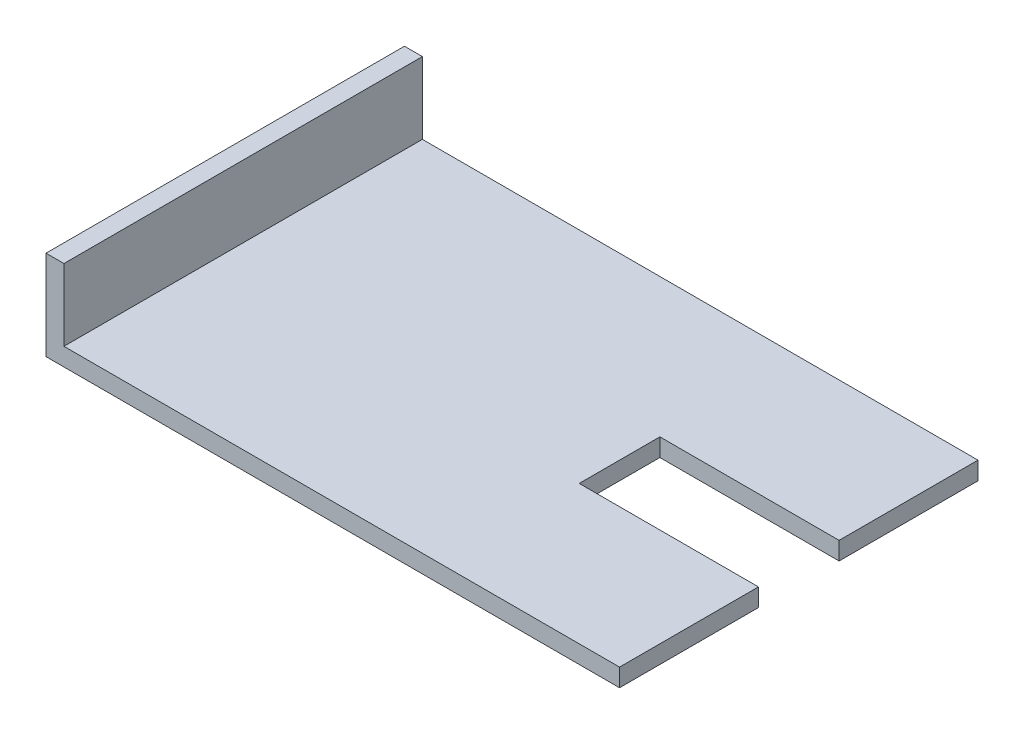
ISO-10303-21;
HEADER;
FILE_DESCRIPTION(('STEP AP214'),'2;1');
FILE_NAME('part.step','',(''),(''),'','','');
FILE_SCHEMA(('AUTOMOTIVE_DESIGN { 1 0 10303 214 1 1 1 1 }'));
ENDSEC;
DATA;
#1=APPLICATION_CONTEXT('core data for automotive mechanical design processes');
#2=APPLICATION_PROTOCOL_DEFINITION('international standard','automotive_design',2000,#1);
#3=PRODUCT_CONTEXT('',#1,'mechanical');
#4=PRODUCT('Part','Part','',(#3));
#5=PRODUCT_RELATED_PRODUCT_CATEGORY('part','',(#4));
#6=PRODUCT_DEFINITION_FORMATION('','',#4);
#7=PRODUCT_DEFINITION_CONTEXT('part definition',#1,'design');
#8=PRODUCT_DEFINITION('design','',#6,#7);
#9=PRODUCT_DEFINITION_SHAPE('','',#8);
#10=(LENGTH_UNIT() NAMED_UNIT(*) SI_UNIT(.MILLI.,.METRE.));
#11=(NAMED_UNIT(*) PLANE_ANGLE_UNIT() SI_UNIT($,.RADIAN.));
#12=(NAMED_UNIT(*) SI_UNIT($,.STERADIAN.) SOLID_ANGLE_UNIT());
#13=UNCERTAINTY_MEASURE_WITH_UNIT(LENGTH_MEASURE(1.E-05),#10,'distance_accuracy_value','');
#14=(GEOMETRIC_REPRESENTATION_CONTEXT(3) GLOBAL_UNCERTAINTY_ASSIGNED_CONTEXT((#13)) GLOBAL_UNIT_ASSIGNED_CONTEXT((#10,
#11,#12)) REPRESENTATION_CONTEXT('',''));
#15=CARTESIAN_POINT('',(0.,0.,0.));
#16=DIRECTION('',(0.,0.,1.));
#17=DIRECTION('',(1.,0.,0.));
#18=AXIS2_PLACEMENT_3D('',#15,#16,#17);
#19=CARTESIAN_POINT('',(320.,0.,200.));
#20=DIRECTION('',(-1.,0.,0.));
#21=DIRECTION('',(0.,0.,1.));
#22=AXIS2_PLACEMENT_3D('',#19,#20,#21);
#23=PLANE('',#22);
#24=DIRECTION('',(0.,0.,-1.));
#25=VECTOR('',#24,1.);
#26=CARTESIAN_POINT('',(320.,0.,200.));
#27=LINE('',#26,#25);
#28=CARTESIAN_POINT('',(320.,0.,200.));
#29=VERTEX_POINT('',#28);
#30=CARTESIAN_POINT('',(320.,0.,122.5));
#31=VERTEX_POINT('',#30);
#32=EDGE_CURVE('E124',#29,#31,#27,.T.);
#33=ORIENTED_EDGE('',*,*,#32,.T.);
#34=DIRECTION('',(0.,1.,0.));
#35=VECTOR('',#34,1.);
#36=CARTESIAN_POINT('',(320.,0.,122.5));
#37=LINE('',#36,#35);
#38=CARTESIAN_POINT('',(320.,10.,122.5));
#39=VERTEX_POINT('',#38);
#40=EDGE_CURVE('E147',#31,#39,#37,.T.);
#41=ORIENTED_EDGE('',*,*,#40,.T.);
#42=DIRECTION('',(0.,0.,-1.));
#43=VECTOR('',#42,1.);
#44=CARTESIAN_POINT('',(320.,10.,200.));
#45=LINE('',#44,#43);
#46=CARTESIAN_POINT('',(320.,10.,200.));
#47=VERTEX_POINT('',#46);
#48=EDGE_CURVE('E159',#47,#39,#45,.T.);
#49=ORIENTED_EDGE('',*,*,#48,.F.);
#50=DIRECTION('',(0.,1.,0.));
#51=VECTOR('',#50,1.);
#52=CARTESIAN_POINT('',(320.,0.,200.));
#53=LINE('',#52,#51);
#54=EDGE_CURVE('E67',#29,#47,#53,.T.);
#55=ORIENTED_EDGE('',*,*,#54,.F.);
#56=EDGE_LOOP('',(#33,#41,#49,#55));
#57=FACE_BOUND('',#56,.T.);
#58=ADVANCED_FACE('F43',(#57),#23,.F.);
#59=CARTESIAN_POINT('',(0.,10.,200.));
#60=DIRECTION('',(0.,1.,0.));
#61=DIRECTION('',(0.,0.,1.));
#62=AXIS2_PLACEMENT_3D('',#59,#60,#61);
#63=PLANE('',#62);
#64=DIRECTION('',(1.,0.,0.));
#65=VECTOR('',#64,1.);
#66=CARTESIAN_POINT('',(320.,10.,122.5));
#67=LINE('',#66,#65);
#68=CARTESIAN_POINT('',(220.,10.,122.5));
#69=VERTEX_POINT('',#68);
#70=EDGE_CURVE('E195',#69,#39,#67,.T.);
#71=ORIENTED_EDGE('',*,*,#70,.F.);
#72=DIRECTION('',(0.,0.,1.));
#73=VECTOR('',#72,1.);
#74=CARTESIAN_POINT('',(220.,10.,77.5));
#75=LINE('',#74,#73);
#76=CARTESIAN_POINT('',(220.,10.,77.5));
#77=VERTEX_POINT('',#76);
#78=EDGE_CURVE('E205',#77,#69,#75,.T.);
#79=ORIENTED_EDGE('',*,*,#78,.F.);
#80=DIRECTION('',(-1.,0.,0.));
#81=VECTOR('',#80,1.);
#82=CARTESIAN_POINT('',(320.,10.,77.4999999999999));
#83=LINE('',#82,#81);
#84=CARTESIAN_POINT('',(320.,10.,77.4999999999999));
#85=VERTEX_POINT('',#84);
#86=EDGE_CURVE('E208',#85,#77,#83,.T.);
#87=ORIENTED_EDGE('',*,*,#86,.F.);
#88=CARTESIAN_POINT('',(320.,10.,0.));
#89=VERTEX_POINT('',#88);
#90=EDGE_CURVE('E94',#85,#89,#45,.T.);
#91=ORIENTED_EDGE('',*,*,#90,.T.);
#92=DIRECTION('',(1.,0.,0.));
#93=VECTOR('',#92,1.);
#94=CARTESIAN_POINT('',(0.,10.,0.));
#95=LINE('',#94,#93);
#96=CARTESIAN_POINT('',(10.,10.,0.));
#97=VERTEX_POINT('',#96);
#98=EDGE_CURVE('E143',#97,#89,#95,.T.);
#99=ORIENTED_EDGE('',*,*,#98,.F.);
#100=DIRECTION('',(0.,0.,-1.));
#101=VECTOR('',#100,1.);
#102=CARTESIAN_POINT('',(10.,10.,200.));
#103=LINE('',#102,#101);
#104=CARTESIAN_POINT('',(10.,10.,200.));
#105=VERTEX_POINT('',#104);
#106=EDGE_CURVE('E11',#105,#97,#103,.T.);
#107=ORIENTED_EDGE('',*,*,#106,.F.);
#108=DIRECTION('',(1.,0.,0.));
#109=VECTOR('',#108,1.);
#110=CARTESIAN_POINT('',(0.,10.,200.));
#111=LINE('',#110,#109);
#112=EDGE_CURVE('E158',#105,#47,#111,.T.);
#113=ORIENTED_EDGE('',*,*,#112,.T.);
#114=ORIENTED_EDGE('',*,*,#48,.T.);
#115=EDGE_LOOP('',(#71,#79,#87,#91,#99,#107,#113,#114));
#116=FACE_BOUND('',#115,.T.);
#117=ADVANCED_FACE('F45',(#116),#63,.T.);
#118=CARTESIAN_POINT('',(10.,0.,200.));
#119=DIRECTION('',(-1.,0.,0.));
#120=DIRECTION('',(0.,0.,1.));
#121=AXIS2_PLACEMENT_3D('',#118,#119,#120);
#122=PLANE('',#121);
#123=DIRECTION('',(0.,1.,0.));
#124=VECTOR('',#123,1.);
#125=CARTESIAN_POINT('',(10.,0.,0.));
#126=LINE('',#125,#124);
#127=CARTESIAN_POINT('',(10.,50.,0.));
#128=VERTEX_POINT('',#127);
#129=EDGE_CURVE('E146',#97,#128,#126,.T.);
#130=ORIENTED_EDGE('',*,*,#129,.T.);
#131=DIRECTION('',(0.,0.,-1.));
#132=VECTOR('',#131,1.);
#133=CARTESIAN_POINT('',(10.,50.,200.));
#134=LINE('',#133,#132);
#135=CARTESIAN_POINT('',(10.,50.,200.));
#136=VERTEX_POINT('',#135);
#137=EDGE_CURVE('E51',#136,#128,#134,.T.);
#138=ORIENTED_EDGE('',*,*,#137,.F.);
#139=DIRECTION('',(0.,1.,0.));
#140=VECTOR('',#139,1.);
#141=CARTESIAN_POINT('',(10.,0.,200.));
#142=LINE('',#141,#140);
#143=EDGE_CURVE('E138',#105,#136,#142,.T.);
#144=ORIENTED_EDGE('',*,*,#143,.F.);
#145=ORIENTED_EDGE('',*,*,#106,.T.);
#146=EDGE_LOOP('',(#130,#138,#144,#145));
#147=FACE_BOUND('',#146,.T.);
#148=ADVANCED_FACE('F170',(#147),#122,.F.);
#149=CARTESIAN_POINT('',(0.,50.,200.));
#150=DIRECTION('',(0.,1.,0.));
#151=DIRECTION('',(0.,0.,1.));
#152=AXIS2_PLACEMENT_3D('',#149,#150,#151);
#153=PLANE('',#152);
#154=DIRECTION('',(1.,0.,0.));
#155=VECTOR('',#154,1.);
#156=CARTESIAN_POINT('',(0.,50.,0.));
#157=LINE('',#156,#155);
#158=CARTESIAN_POINT('',(0.,50.,0.));
#159=VERTEX_POINT('',#158);
#160=EDGE_CURVE('E150',#159,#128,#157,.T.);
#161=ORIENTED_EDGE('',*,*,#160,.F.);
#162=DIRECTION('',(0.,0.,-1.));
#163=VECTOR('',#162,1.);
#164=CARTESIAN_POINT('',(0.,50.,200.));
#165=LINE('',#164,#163);
#166=CARTESIAN_POINT('',(0.,50.,200.));
#167=VERTEX_POINT('',#166);
#168=EDGE_CURVE('E123',#167,#159,#165,.T.);
#169=ORIENTED_EDGE('',*,*,#168,.F.);
#170=DIRECTION('',(1.,0.,0.));
#171=VECTOR('',#170,1.);
#172=CARTESIAN_POINT('',(0.,50.,200.));
#173=LINE('',#172,#171);
#174=EDGE_CURVE('E136',#167,#136,#173,.T.);
#175=ORIENTED_EDGE('',*,*,#174,.T.);
#176=ORIENTED_EDGE('',*,*,#137,.T.);
#177=EDGE_LOOP('',(#161,#169,#175,#176));
#178=FACE_BOUND('',#177,.T.);
#179=ADVANCED_FACE('F167',(#178),#153,.T.);
#180=CARTESIAN_POINT('',(0.,0.,200.));
#181=DIRECTION('',(-1.,0.,0.));
#182=DIRECTION('',(0.,0.,1.));
#183=AXIS2_PLACEMENT_3D('',#180,#181,#182);
#184=PLANE('',#183);
#185=DIRECTION('',(0.,1.,0.));
#186=VECTOR('',#185,1.);
#187=CARTESIAN_POINT('',(0.,0.,0.));
#188=LINE('',#187,#186);
#189=CARTESIAN_POINT('',(0.,0.,0.));
#190=VERTEX_POINT('',#189);
#191=EDGE_CURVE('E119',#190,#159,#188,.T.);
#192=ORIENTED_EDGE('',*,*,#191,.F.);
#193=DIRECTION('',(0.,0.,-1.));
#194=VECTOR('',#193,1.);
#195=CARTESIAN_POINT('',(0.,0.,200.));
#196=LINE('',#195,#194);
#197=CARTESIAN_POINT('',(0.,0.,200.));
#198=VERTEX_POINT('',#197);
#199=EDGE_CURVE('E113',#198,#190,#196,.T.);
#200=ORIENTED_EDGE('',*,*,#199,.F.);
#201=DIRECTION('',(0.,1.,0.));
#202=VECTOR('',#201,1.);
#203=CARTESIAN_POINT('',(0.,0.,200.));
#204=LINE('',#203,#202);
#205=EDGE_CURVE('E117',#198,#167,#204,.T.);
#206=ORIENTED_EDGE('',*,*,#205,.T.);
#207=ORIENTED_EDGE('',*,*,#168,.T.);
#208=EDGE_LOOP('',(#192,#200,#206,#207));
#209=FACE_BOUND('',#208,.T.);
#210=ADVANCED_FACE('F115',(#209),#184,.T.);
#211=CARTESIAN_POINT('',(0.,0.,200.));
#212=DIRECTION('',(0.,1.,0.));
#213=DIRECTION('',(0.,0.,1.));
#214=AXIS2_PLACEMENT_3D('',#211,#212,#213);
#215=PLANE('',#214);
#216=DIRECTION('',(0.,0.,1.));
#217=VECTOR('',#216,1.);
#218=CARTESIAN_POINT('',(220.,0.,77.5));
#219=LINE('',#218,#217);
#220=CARTESIAN_POINT('',(220.,0.,77.5));
#221=VERTEX_POINT('',#220);
#222=CARTESIAN_POINT('',(220.,0.,122.5));
#223=VERTEX_POINT('',#222);
#224=EDGE_CURVE('E187',#221,#223,#219,.T.);
#225=ORIENTED_EDGE('',*,*,#224,.T.);
#226=DIRECTION('',(1.,0.,0.));
#227=VECTOR('',#226,1.);
#228=CARTESIAN_POINT('',(320.,0.,122.5));
#229=LINE('',#228,#227);
#230=EDGE_CURVE('E182',#223,#31,#229,.T.);
#231=ORIENTED_EDGE('',*,*,#230,.T.);
#232=ORIENTED_EDGE('',*,*,#32,.F.);
#233=DIRECTION('',(1.,0.,0.));
#234=VECTOR('',#233,1.);
#235=CARTESIAN_POINT('',(0.,0.,200.));
#236=LINE('',#235,#234);
#237=EDGE_CURVE('E127',#198,#29,#236,.T.);
#238=ORIENTED_EDGE('',*,*,#237,.F.);
#239=ORIENTED_EDGE('',*,*,#199,.T.);
#240=DIRECTION('',(1.,0.,0.));
#241=VECTOR('',#240,1.);
#242=CARTESIAN_POINT('',(0.,0.,0.));
#243=LINE('',#242,#241);
#244=CARTESIAN_POINT('',(320.,0.,0.));
#245=VERTEX_POINT('',#244);
#246=EDGE_CURVE('E154',#190,#245,#243,.T.);
#247=ORIENTED_EDGE('',*,*,#246,.T.);
#248=CARTESIAN_POINT('',(320.,0.,77.4999999999999));
#249=VERTEX_POINT('',#248);
#250=EDGE_CURVE('E162',#249,#245,#27,.T.);
#251=ORIENTED_EDGE('',*,*,#250,.F.);
#252=DIRECTION('',(-1.,0.,0.));
#253=VECTOR('',#252,1.);
#254=CARTESIAN_POINT('',(320.,0.,77.4999999999999));
#255=LINE('',#254,#253);
#256=EDGE_CURVE('E58',#249,#221,#255,.T.);
#257=ORIENTED_EDGE('',*,*,#256,.T.);
#258=EDGE_LOOP('',(#225,#231,#232,#238,#239,#247,#251,#257));
#259=FACE_BOUND('',#258,.T.);
#260=ADVANCED_FACE('F129',(#259),#215,.F.);
#261=ORIENTED_EDGE('',*,*,#90,.F.);
#262=DIRECTION('',(0.,1.,0.));
#263=VECTOR('',#262,1.);
#264=CARTESIAN_POINT('',(320.,0.,77.4999999999999));
#265=LINE('',#264,#263);
#266=EDGE_CURVE('E178',#249,#85,#265,.T.);
#267=ORIENTED_EDGE('',*,*,#266,.F.);
#268=ORIENTED_EDGE('',*,*,#250,.T.);
#269=DIRECTION('',(0.,1.,0.));
#270=VECTOR('',#269,1.);
#271=CARTESIAN_POINT('',(320.,0.,0.));
#272=LINE('',#271,#270);
#273=EDGE_CURVE('E156',#245,#89,#272,.T.);
#274=ORIENTED_EDGE('',*,*,#273,.T.);
#275=EDGE_LOOP('',(#261,#267,#268,#274));
#276=FACE_BOUND('',#275,.T.);
#277=ADVANCED_FACE('F177',(#276),#23,.F.);
#278=CARTESIAN_POINT('',(0.,0.,200.));
#279=DIRECTION('',(0.,0.,1.));
#280=DIRECTION('',(1.,0.,0.));
#281=AXIS2_PLACEMENT_3D('',#278,#279,#280);
#282=PLANE('',#281);
#283=ORIENTED_EDGE('',*,*,#112,.F.);
#284=ORIENTED_EDGE('',*,*,#143,.T.);
#285=ORIENTED_EDGE('',*,*,#174,.F.);
#286=ORIENTED_EDGE('',*,*,#205,.F.);
#287=ORIENTED_EDGE('',*,*,#237,.T.);
#288=ORIENTED_EDGE('',*,*,#54,.T.);
#289=EDGE_LOOP('',(#283,#284,#285,#286,#287,#288));
#290=FACE_BOUND('',#289,.T.);
#291=ADVANCED_FACE('F134',(#290),#282,.T.);
#292=CARTESIAN_POINT('',(0.,0.,0.));
#293=DIRECTION('',(0.,0.,1.));
#294=DIRECTION('',(1.,0.,0.));
#295=AXIS2_PLACEMENT_3D('',#292,#293,#294);
#296=PLANE('',#295);
#297=ORIENTED_EDGE('',*,*,#98,.T.);
#298=ORIENTED_EDGE('',*,*,#273,.F.);
#299=ORIENTED_EDGE('',*,*,#246,.F.);
#300=ORIENTED_EDGE('',*,*,#191,.T.);
#301=ORIENTED_EDGE('',*,*,#160,.T.);
#302=ORIENTED_EDGE('',*,*,#129,.F.);
#303=EDGE_LOOP('',(#297,#298,#299,#300,#301,#302));
#304=FACE_BOUND('',#303,.T.);
#305=ADVANCED_FACE('F172',(#304),#296,.F.);
#306=CARTESIAN_POINT('',(320.,0.,122.5));
#307=DIRECTION('',(0.,0.,1.));
#308=DIRECTION('',(1.,0.,0.));
#309=AXIS2_PLACEMENT_3D('',#306,#307,#308);
#310=PLANE('',#309);
#311=ORIENTED_EDGE('',*,*,#70,.T.);
#312=ORIENTED_EDGE('',*,*,#40,.F.);
#313=ORIENTED_EDGE('',*,*,#230,.F.);
#314=DIRECTION('',(0.,1.,0.));
#315=VECTOR('',#314,1.);
#316=CARTESIAN_POINT('',(220.,0.,122.5));
#317=LINE('',#316,#315);
#318=EDGE_CURVE('E185',#223,#69,#317,.T.);
#319=ORIENTED_EDGE('',*,*,#318,.T.);
#320=EDGE_LOOP('',(#311,#312,#313,#319));
#321=FACE_BOUND('',#320,.T.);
#322=ADVANCED_FACE('F222',(#321),#310,.F.);
#323=CARTESIAN_POINT('',(220.,0.,77.5));
#324=DIRECTION('',(-1.,0.,0.));
#325=DIRECTION('',(0.,0.,1.));
#326=AXIS2_PLACEMENT_3D('',#323,#324,#325);
#327=PLANE('',#326);
#328=ORIENTED_EDGE('',*,*,#78,.T.);
#329=ORIENTED_EDGE('',*,*,#318,.F.);
#330=ORIENTED_EDGE('',*,*,#224,.F.);
#331=DIRECTION('',(0.,1.,0.));
#332=VECTOR('',#331,1.);
#333=CARTESIAN_POINT('',(220.,0.,77.5));
#334=LINE('',#333,#332);
#335=EDGE_CURVE('E181',#221,#77,#334,.T.);
#336=ORIENTED_EDGE('',*,*,#335,.T.);
#337=EDGE_LOOP('',(#328,#329,#330,#336));
#338=FACE_BOUND('',#337,.T.);
#339=ADVANCED_FACE('F216',(#338),#327,.F.);
#340=CARTESIAN_POINT('',(320.,0.,77.4999999999999));
#341=DIRECTION('',(0.,0.,-1.));
#342=DIRECTION('',(-1.,0.,0.));
#343=AXIS2_PLACEMENT_3D('',#340,#341,#342);
#344=PLANE('',#343);
#345=ORIENTED_EDGE('',*,*,#86,.T.);
#346=ORIENTED_EDGE('',*,*,#335,.F.);
#347=ORIENTED_EDGE('',*,*,#256,.F.);
#348=ORIENTED_EDGE('',*,*,#266,.T.);
#349=EDGE_LOOP('',(#345,#346,#347,#348));
#350=FACE_BOUND('',#349,.T.);
#351=ADVANCED_FACE('F223',(#350),#344,.F.);
#352=CLOSED_SHELL('',(#58,#117,#148,#179,#210,#260,#277,#291,#305,#322,#339,#351));
#353=MANIFOLD_SOLID_BREP('B2',#352);
#354=ADVANCED_BREP_SHAPE_REPRESENTATION('',(#18,#353),#14);
#355=SHAPE_DEFINITION_REPRESENTATION(#9,#354);
ENDSEC;
END-ISO-10303-21;
